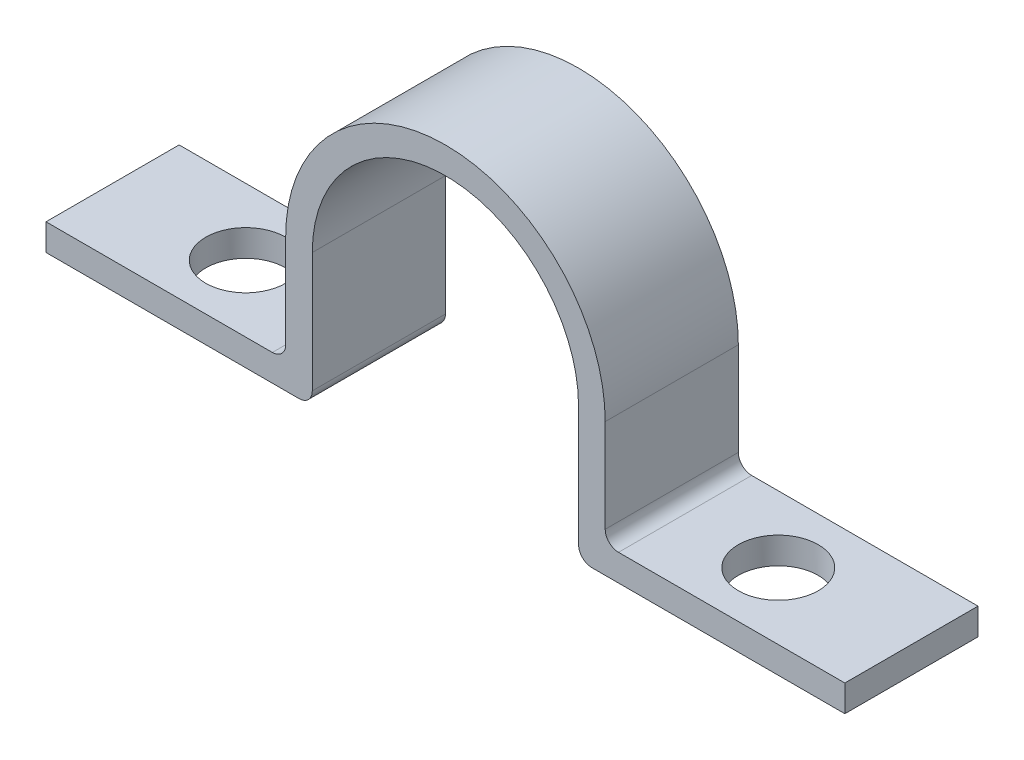
ISO-10303-21;
HEADER;
FILE_DESCRIPTION(('STEP AP214'),'2;1');
FILE_NAME('part.step','',(''),(''),'','','');
FILE_SCHEMA(('AUTOMOTIVE_DESIGN { 1 0 10303 214 1 1 1 1 }'));
ENDSEC;
DATA;
#1=APPLICATION_CONTEXT('core data for automotive mechanical design processes');
#2=APPLICATION_PROTOCOL_DEFINITION('international standard','automotive_design',2000,#1);
#3=PRODUCT_CONTEXT('',#1,'mechanical');
#4=PRODUCT('Part','Part','',(#3));
#5=PRODUCT_RELATED_PRODUCT_CATEGORY('part','',(#4));
#6=PRODUCT_DEFINITION_FORMATION('','',#4);
#7=PRODUCT_DEFINITION_CONTEXT('part definition',#1,'design');
#8=PRODUCT_DEFINITION('design','',#6,#7);
#9=PRODUCT_DEFINITION_SHAPE('','',#8);
#10=(LENGTH_UNIT() NAMED_UNIT(*) SI_UNIT(.MILLI.,.METRE.));
#11=(NAMED_UNIT(*) PLANE_ANGLE_UNIT() SI_UNIT($,.RADIAN.));
#12=(NAMED_UNIT(*) SI_UNIT($,.STERADIAN.) SOLID_ANGLE_UNIT());
#13=UNCERTAINTY_MEASURE_WITH_UNIT(LENGTH_MEASURE(1.E-05),#10,'distance_accuracy_value','');
#14=(GEOMETRIC_REPRESENTATION_CONTEXT(3) GLOBAL_UNCERTAINTY_ASSIGNED_CONTEXT((#13)) GLOBAL_UNIT_ASSIGNED_CONTEXT((#10,
#11,#12)) REPRESENTATION_CONTEXT('',''));
#15=CARTESIAN_POINT('',(0.,0.,0.));
#16=DIRECTION('',(0.,0.,1.));
#17=DIRECTION('',(1.,0.,0.));
#18=AXIS2_PLACEMENT_3D('',#15,#16,#17);
#19=CARTESIAN_POINT('',(0.,5.,5.));
#20=DIRECTION('',(0.,0.,-1.));
#21=DIRECTION('',(-1.,0.,0.));
#22=AXIS2_PLACEMENT_3D('',#19,#20,#21);
#23=CYLINDRICAL_SURFACE('',#22,5.);
#24=CARTESIAN_POINT('',(0.,5.,0.));
#25=DIRECTION('',(0.,0.,-1.));
#26=DIRECTION('',(1.,0.,0.));
#27=AXIS2_PLACEMENT_3D('',#24,#25,#26);
#28=CIRCLE('',#27,5.);
#29=CARTESIAN_POINT('',(-5.,5.,0.));
#30=VERTEX_POINT('',#29);
#31=CARTESIAN_POINT('',(5.,5.,0.));
#32=VERTEX_POINT('',#31);
#33=EDGE_CURVE('E185',#30,#32,#28,.T.);
#34=ORIENTED_EDGE('',*,*,#33,.T.);
#35=DIRECTION('',(0.,0.,-1.));
#36=VECTOR('',#35,1.);
#37=CARTESIAN_POINT('',(5.,5.,5.));
#38=LINE('',#37,#36);
#39=CARTESIAN_POINT('',(5.,5.,5.));
#40=VERTEX_POINT('',#39);
#41=EDGE_CURVE('E11',#40,#32,#38,.T.);
#42=ORIENTED_EDGE('',*,*,#41,.F.);
#43=CARTESIAN_POINT('',(0.,5.,5.));
#44=DIRECTION('',(0.,0.,-1.));
#45=DIRECTION('',(1.,0.,0.));
#46=AXIS2_PLACEMENT_3D('',#43,#44,#45);
#47=CIRCLE('',#46,5.);
#48=CARTESIAN_POINT('',(-5.,5.,5.));
#49=VERTEX_POINT('',#48);
#50=EDGE_CURVE('E215',#49,#40,#47,.T.);
#51=ORIENTED_EDGE('',*,*,#50,.F.);
#52=DIRECTION('',(0.,0.,-1.));
#53=VECTOR('',#52,1.);
#54=CARTESIAN_POINT('',(-5.,5.,5.));
#55=LINE('',#54,#53);
#56=EDGE_CURVE('E181',#49,#30,#55,.T.);
#57=ORIENTED_EDGE('',*,*,#56,.T.);
#58=EDGE_LOOP('',(#34,#42,#51,#57));
#59=FACE_BOUND('',#58,.T.);
#60=ADVANCED_FACE('F40',(#59),#23,.F.);
#61=CARTESIAN_POINT('',(5.,5.,5.));
#62=DIRECTION('',(1.,-4.47751403854925E-13,0.));
#63=DIRECTION('',(4.47751403854925E-13,1.,0.));
#64=AXIS2_PLACEMENT_3D('',#61,#62,#63);
#65=PLANE('',#64);
#66=DIRECTION('',(-4.47751403854925E-13,-1.,0.));
#67=VECTOR('',#66,1.);
#68=CARTESIAN_POINT('',(5.,5.,0.));
#69=LINE('',#68,#67);
#70=CARTESIAN_POINT('',(4.99999999999799,0.500000000000227,0.));
#71=VERTEX_POINT('',#70);
#72=EDGE_CURVE('E188',#32,#71,#69,.T.);
#73=ORIENTED_EDGE('',*,*,#72,.T.);
#74=DIRECTION('',(0.,0.,-1.));
#75=VECTOR('',#74,1.);
#76=CARTESIAN_POINT('',(4.99999999999799,0.500000000000227,5.));
#77=LINE('',#76,#75);
#78=CARTESIAN_POINT('',(4.99999999999799,0.500000000000227,5.));
#79=VERTEX_POINT('',#78);
#80=EDGE_CURVE('E49',#79,#71,#77,.T.);
#81=ORIENTED_EDGE('',*,*,#80,.F.);
#82=DIRECTION('',(-4.47751403854925E-13,-1.,0.));
#83=VECTOR('',#82,1.);
#84=CARTESIAN_POINT('',(5.,5.,5.));
#85=LINE('',#84,#83);
#86=EDGE_CURVE('E124',#40,#79,#85,.T.);
#87=ORIENTED_EDGE('',*,*,#86,.F.);
#88=ORIENTED_EDGE('',*,*,#41,.T.);
#89=EDGE_LOOP('',(#73,#81,#87,#88));
#90=FACE_BOUND('',#89,.T.);
#91=ADVANCED_FACE('F314',(#90),#65,.F.);
#92=CARTESIAN_POINT('',(5.49999999999799,0.5,5.));
#93=DIRECTION('',(0.,0.,-1.));
#94=DIRECTION('',(-1.,0.,0.));
#95=AXIS2_PLACEMENT_3D('',#92,#93,#94);
#96=CYLINDRICAL_SURFACE('',#95,0.5);
#97=CARTESIAN_POINT('',(5.49999999999799,0.5,0.));
#98=DIRECTION('',(0.,0.,1.));
#99=DIRECTION('',(-1.,0.,0.));
#100=AXIS2_PLACEMENT_3D('',#97,#98,#99);
#101=CIRCLE('',#100,0.5);
#102=CARTESIAN_POINT('',(5.49999999999799,0.,0.));
#103=VERTEX_POINT('',#102);
#104=EDGE_CURVE('E190',#71,#103,#101,.T.);
#105=ORIENTED_EDGE('',*,*,#104,.T.);
#106=DIRECTION('',(0.,0.,-1.));
#107=VECTOR('',#106,1.);
#108=CARTESIAN_POINT('',(5.49999999999799,0.,5.));
#109=LINE('',#108,#107);
#110=CARTESIAN_POINT('',(5.49999999999799,0.,5.));
#111=VERTEX_POINT('',#110);
#112=EDGE_CURVE('E246',#111,#103,#109,.T.);
#113=ORIENTED_EDGE('',*,*,#112,.F.);
#114=CARTESIAN_POINT('',(5.49999999999799,0.5,5.));
#115=DIRECTION('',(0.,0.,1.));
#116=DIRECTION('',(-1.,0.,0.));
#117=AXIS2_PLACEMENT_3D('',#114,#115,#116);
#118=CIRCLE('',#117,0.5);
#119=EDGE_CURVE('E255',#79,#111,#118,.T.);
#120=ORIENTED_EDGE('',*,*,#119,.F.);
#121=ORIENTED_EDGE('',*,*,#80,.T.);
#122=EDGE_LOOP('',(#105,#113,#120,#121));
#123=FACE_BOUND('',#122,.T.);
#124=ADVANCED_FACE('F253',(#123),#96,.T.);
#125=CARTESIAN_POINT('',(5.49999999999799,0.,5.));
#126=DIRECTION('',(0.,1.,0.));
#127=DIRECTION('',(0.,0.,1.));
#128=AXIS2_PLACEMENT_3D('',#125,#126,#127);
#129=PLANE('',#128);
#130=CARTESIAN_POINT('',(10.,0.,2.5));
#131=DIRECTION('',(0.,1.,0.));
#132=DIRECTION('',(0.,0.,1.));
#133=AXIS2_PLACEMENT_3D('',#130,#131,#132);
#134=CIRCLE('',#133,1.5);
#135=CARTESIAN_POINT('',(10.,0.,4.));
#136=VERTEX_POINT('',#135);
#137=EDGE_CURVE('E366',#136,#136,#134,.T.);
#138=ORIENTED_EDGE('',*,*,#137,.T.);
#139=EDGE_LOOP('',(#138));
#140=FACE_BOUND('',#139,.T.);
#141=DIRECTION('',(1.,0.,0.));
#142=VECTOR('',#141,1.);
#143=CARTESIAN_POINT('',(5.49999999999799,0.,0.));
#144=LINE('',#143,#142);
#145=CARTESIAN_POINT('',(15.,0.,0.));
#146=VERTEX_POINT('',#145);
#147=EDGE_CURVE('E192',#103,#146,#144,.T.);
#148=ORIENTED_EDGE('',*,*,#147,.T.);
#149=DIRECTION('',(0.,0.,-1.));
#150=VECTOR('',#149,1.);
#151=CARTESIAN_POINT('',(15.,0.,5.));
#152=LINE('',#151,#150);
#153=CARTESIAN_POINT('',(15.,0.,5.));
#154=VERTEX_POINT('',#153);
#155=EDGE_CURVE('E243',#154,#146,#152,.T.);
#156=ORIENTED_EDGE('',*,*,#155,.F.);
#157=DIRECTION('',(1.,0.,0.));
#158=VECTOR('',#157,1.);
#159=CARTESIAN_POINT('',(5.49999999999799,0.,5.));
#160=LINE('',#159,#158);
#161=EDGE_CURVE('E273',#111,#154,#160,.T.);
#162=ORIENTED_EDGE('',*,*,#161,.F.);
#163=ORIENTED_EDGE('',*,*,#112,.T.);
#164=EDGE_LOOP('',(#148,#156,#162,#163));
#165=FACE_BOUND('',#164,.T.);
#166=ADVANCED_FACE('F264',(#140,#165),#129,.F.);
#167=CARTESIAN_POINT('',(15.,1.,5.));
#168=DIRECTION('',(-1.,0.,0.));
#169=DIRECTION('',(0.,0.,1.));
#170=AXIS2_PLACEMENT_3D('',#167,#168,#169);
#171=PLANE('',#170);
#172=DIRECTION('',(0.,1.,0.));
#173=VECTOR('',#172,1.);
#174=CARTESIAN_POINT('',(15.,1.,0.));
#175=LINE('',#174,#173);
#176=CARTESIAN_POINT('',(15.,1.,0.));
#177=VERTEX_POINT('',#176);
#178=EDGE_CURVE('E194',#146,#177,#175,.T.);
#179=ORIENTED_EDGE('',*,*,#178,.T.);
#180=DIRECTION('',(0.,0.,-1.));
#181=VECTOR('',#180,1.);
#182=CARTESIAN_POINT('',(15.,1.,5.));
#183=LINE('',#182,#181);
#184=CARTESIAN_POINT('',(15.,1.,5.));
#185=VERTEX_POINT('',#184);
#186=EDGE_CURVE('E240',#185,#177,#183,.T.);
#187=ORIENTED_EDGE('',*,*,#186,.F.);
#188=DIRECTION('',(0.,1.,0.));
#189=VECTOR('',#188,1.);
#190=CARTESIAN_POINT('',(15.,1.,5.));
#191=LINE('',#190,#189);
#192=EDGE_CURVE('E270',#154,#185,#191,.T.);
#193=ORIENTED_EDGE('',*,*,#192,.F.);
#194=ORIENTED_EDGE('',*,*,#155,.T.);
#195=EDGE_LOOP('',(#179,#187,#193,#194));
#196=FACE_BOUND('',#195,.T.);
#197=ADVANCED_FACE('F268',(#196),#171,.F.);
#198=CARTESIAN_POINT('',(6.5,1.,5.));
#199=DIRECTION('',(0.,-1.,0.));
#200=DIRECTION('',(0.,0.,-1.));
#201=AXIS2_PLACEMENT_3D('',#198,#199,#200);
#202=PLANE('',#201);
#203=CARTESIAN_POINT('',(10.,1.,2.5));
#204=DIRECTION('',(0.,-1.,0.));
#205=DIRECTION('',(0.,0.,-1.));
#206=AXIS2_PLACEMENT_3D('',#203,#204,#205);
#207=CIRCLE('',#206,1.5);
#208=CARTESIAN_POINT('',(10.,1.,0.999999999999999));
#209=VERTEX_POINT('',#208);
#210=EDGE_CURVE('E43',#209,#209,#207,.T.);
#211=ORIENTED_EDGE('',*,*,#210,.T.);
#212=EDGE_LOOP('',(#211));
#213=FACE_BOUND('',#212,.T.);
#214=DIRECTION('',(-1.,0.,0.));
#215=VECTOR('',#214,1.);
#216=CARTESIAN_POINT('',(6.5,1.,0.));
#217=LINE('',#216,#215);
#218=CARTESIAN_POINT('',(6.5,1.,0.));
#219=VERTEX_POINT('',#218);
#220=EDGE_CURVE('E196',#177,#219,#217,.T.);
#221=ORIENTED_EDGE('',*,*,#220,.T.);
#222=DIRECTION('',(0.,0.,-1.));
#223=VECTOR('',#222,1.);
#224=CARTESIAN_POINT('',(6.5,1.,5.));
#225=LINE('',#224,#223);
#226=CARTESIAN_POINT('',(6.5,1.,5.));
#227=VERTEX_POINT('',#226);
#228=EDGE_CURVE('E237',#227,#219,#225,.T.);
#229=ORIENTED_EDGE('',*,*,#228,.F.);
#230=DIRECTION('',(-1.,0.,0.));
#231=VECTOR('',#230,1.);
#232=CARTESIAN_POINT('',(6.5,1.,5.));
#233=LINE('',#232,#231);
#234=EDGE_CURVE('E272',#185,#227,#233,.T.);
#235=ORIENTED_EDGE('',*,*,#234,.F.);
#236=ORIENTED_EDGE('',*,*,#186,.T.);
#237=EDGE_LOOP('',(#221,#229,#235,#236));
#238=FACE_BOUND('',#237,.T.);
#239=ADVANCED_FACE('F328',(#213,#238),#202,.F.);
#240=CARTESIAN_POINT('',(6.5,1.5,5.));
#241=DIRECTION('',(0.,0.,-1.));
#242=DIRECTION('',(-1.,0.,0.));
#243=AXIS2_PLACEMENT_3D('',#240,#241,#242);
#244=CYLINDRICAL_SURFACE('',#243,0.5);
#245=CARTESIAN_POINT('',(6.5,1.5,0.));
#246=DIRECTION('',(0.,0.,-1.));
#247=DIRECTION('',(-1.,0.,0.));
#248=AXIS2_PLACEMENT_3D('',#245,#246,#247);
#249=CIRCLE('',#248,0.5);
#250=CARTESIAN_POINT('',(6.,1.5,0.));
#251=VERTEX_POINT('',#250);
#252=EDGE_CURVE('E198',#219,#251,#249,.T.);
#253=ORIENTED_EDGE('',*,*,#252,.T.);
#254=DIRECTION('',(0.,0.,-1.));
#255=VECTOR('',#254,1.);
#256=CARTESIAN_POINT('',(6.,1.5,5.));
#257=LINE('',#256,#255);
#258=CARTESIAN_POINT('',(6.,1.5,5.));
#259=VERTEX_POINT('',#258);
#260=EDGE_CURVE('E234',#259,#251,#257,.T.);
#261=ORIENTED_EDGE('',*,*,#260,.F.);
#262=CARTESIAN_POINT('',(6.5,1.5,5.));
#263=DIRECTION('',(0.,0.,-1.));
#264=DIRECTION('',(-1.,0.,0.));
#265=AXIS2_PLACEMENT_3D('',#262,#263,#264);
#266=CIRCLE('',#265,0.5);
#267=EDGE_CURVE('E275',#227,#259,#266,.T.);
#268=ORIENTED_EDGE('',*,*,#267,.F.);
#269=ORIENTED_EDGE('',*,*,#228,.T.);
#270=EDGE_LOOP('',(#253,#261,#268,#269));
#271=FACE_BOUND('',#270,.T.);
#272=ADVANCED_FACE('F331',(#271),#244,.F.);
#273=CARTESIAN_POINT('',(6.,5.,5.));
#274=DIRECTION('',(-1.,0.,0.));
#275=DIRECTION('',(0.,0.,1.));
#276=AXIS2_PLACEMENT_3D('',#273,#274,#275);
#277=PLANE('',#276);
#278=DIRECTION('',(0.,1.,0.));
#279=VECTOR('',#278,1.);
#280=CARTESIAN_POINT('',(6.,5.,0.));
#281=LINE('',#280,#279);
#282=CARTESIAN_POINT('',(6.,5.,0.));
#283=VERTEX_POINT('',#282);
#284=EDGE_CURVE('E200',#251,#283,#281,.T.);
#285=ORIENTED_EDGE('',*,*,#284,.T.);
#286=DIRECTION('',(0.,0.,-1.));
#287=VECTOR('',#286,1.);
#288=CARTESIAN_POINT('',(6.,5.,5.));
#289=LINE('',#288,#287);
#290=CARTESIAN_POINT('',(6.,5.,5.));
#291=VERTEX_POINT('',#290);
#292=EDGE_CURVE('E231',#291,#283,#289,.T.);
#293=ORIENTED_EDGE('',*,*,#292,.F.);
#294=DIRECTION('',(0.,1.,0.));
#295=VECTOR('',#294,1.);
#296=CARTESIAN_POINT('',(6.,5.,5.));
#297=LINE('',#296,#295);
#298=EDGE_CURVE('E281',#259,#291,#297,.T.);
#299=ORIENTED_EDGE('',*,*,#298,.F.);
#300=ORIENTED_EDGE('',*,*,#260,.T.);
#301=EDGE_LOOP('',(#285,#293,#299,#300));
#302=FACE_BOUND('',#301,.T.);
#303=ADVANCED_FACE('F335',(#302),#277,.F.);
#304=CARTESIAN_POINT('',(0.,5.,5.));
#305=DIRECTION('',(0.,0.,-1.));
#306=DIRECTION('',(-1.,0.,0.));
#307=AXIS2_PLACEMENT_3D('',#304,#305,#306);
#308=CYLINDRICAL_SURFACE('',#307,6.);
#309=CARTESIAN_POINT('',(0.,5.,0.));
#310=DIRECTION('',(0.,0.,1.));
#311=DIRECTION('',(1.,0.,0.));
#312=AXIS2_PLACEMENT_3D('',#309,#310,#311);
#313=CIRCLE('',#312,6.);
#314=CARTESIAN_POINT('',(-6.,5.,0.));
#315=VERTEX_POINT('',#314);
#316=EDGE_CURVE('E202',#283,#315,#313,.T.);
#317=ORIENTED_EDGE('',*,*,#316,.T.);
#318=DIRECTION('',(0.,0.,-1.));
#319=VECTOR('',#318,1.);
#320=CARTESIAN_POINT('',(-6.,5.,5.));
#321=LINE('',#320,#319);
#322=CARTESIAN_POINT('',(-6.,5.,5.));
#323=VERTEX_POINT('',#322);
#324=EDGE_CURVE('E228',#323,#315,#321,.T.);
#325=ORIENTED_EDGE('',*,*,#324,.F.);
#326=CARTESIAN_POINT('',(0.,5.,5.));
#327=DIRECTION('',(0.,0.,1.));
#328=DIRECTION('',(1.,0.,0.));
#329=AXIS2_PLACEMENT_3D('',#326,#327,#328);
#330=CIRCLE('',#329,6.);
#331=EDGE_CURVE('E283',#291,#323,#330,.T.);
#332=ORIENTED_EDGE('',*,*,#331,.F.);
#333=ORIENTED_EDGE('',*,*,#292,.T.);
#334=EDGE_LOOP('',(#317,#325,#332,#333));
#335=FACE_BOUND('',#334,.T.);
#336=ADVANCED_FACE('F339',(#335),#308,.T.);
#337=CARTESIAN_POINT('',(-6.,5.,5.));
#338=DIRECTION('',(1.,0.,0.));
#339=DIRECTION('',(0.,0.,-1.));
#340=AXIS2_PLACEMENT_3D('',#337,#338,#339);
#341=PLANE('',#340);
#342=DIRECTION('',(0.,-1.,0.));
#343=VECTOR('',#342,1.);
#344=CARTESIAN_POINT('',(-6.,5.,0.));
#345=LINE('',#344,#343);
#346=CARTESIAN_POINT('',(-6.,1.5,0.));
#347=VERTEX_POINT('',#346);
#348=EDGE_CURVE('E204',#315,#347,#345,.T.);
#349=ORIENTED_EDGE('',*,*,#348,.T.);
#350=DIRECTION('',(0.,0.,-1.));
#351=VECTOR('',#350,1.);
#352=CARTESIAN_POINT('',(-6.,1.5,5.));
#353=LINE('',#352,#351);
#354=CARTESIAN_POINT('',(-6.,1.5,5.));
#355=VERTEX_POINT('',#354);
#356=EDGE_CURVE('E225',#355,#347,#353,.T.);
#357=ORIENTED_EDGE('',*,*,#356,.F.);
#358=DIRECTION('',(0.,-1.,0.));
#359=VECTOR('',#358,1.);
#360=CARTESIAN_POINT('',(-6.,5.,5.));
#361=LINE('',#360,#359);
#362=EDGE_CURVE('E285',#323,#355,#361,.T.);
#363=ORIENTED_EDGE('',*,*,#362,.F.);
#364=ORIENTED_EDGE('',*,*,#324,.T.);
#365=EDGE_LOOP('',(#349,#357,#363,#364));
#366=FACE_BOUND('',#365,.T.);
#367=ADVANCED_FACE('F343',(#366),#341,.F.);
#368=CARTESIAN_POINT('',(-6.5,1.5,5.));
#369=DIRECTION('',(0.,0.,-1.));
#370=DIRECTION('',(-1.,0.,0.));
#371=AXIS2_PLACEMENT_3D('',#368,#369,#370);
#372=CYLINDRICAL_SURFACE('',#371,0.5);
#373=CARTESIAN_POINT('',(-6.5,1.5,0.));
#374=DIRECTION('',(0.,0.,-1.));
#375=DIRECTION('',(1.,0.,0.));
#376=AXIS2_PLACEMENT_3D('',#373,#374,#375);
#377=CIRCLE('',#376,0.5);
#378=CARTESIAN_POINT('',(-6.5,1.,0.));
#379=VERTEX_POINT('',#378);
#380=EDGE_CURVE('E206',#347,#379,#377,.T.);
#381=ORIENTED_EDGE('',*,*,#380,.T.);
#382=DIRECTION('',(0.,0.,-1.));
#383=VECTOR('',#382,1.);
#384=CARTESIAN_POINT('',(-6.5,1.,5.));
#385=LINE('',#384,#383);
#386=CARTESIAN_POINT('',(-6.5,1.,5.));
#387=VERTEX_POINT('',#386);
#388=EDGE_CURVE('E222',#387,#379,#385,.T.);
#389=ORIENTED_EDGE('',*,*,#388,.F.);
#390=CARTESIAN_POINT('',(-6.5,1.5,5.));
#391=DIRECTION('',(0.,0.,-1.));
#392=DIRECTION('',(1.,0.,0.));
#393=AXIS2_PLACEMENT_3D('',#390,#391,#392);
#394=CIRCLE('',#393,0.5);
#395=EDGE_CURVE('E287',#355,#387,#394,.T.);
#396=ORIENTED_EDGE('',*,*,#395,.F.);
#397=ORIENTED_EDGE('',*,*,#356,.T.);
#398=EDGE_LOOP('',(#381,#389,#396,#397));
#399=FACE_BOUND('',#398,.T.);
#400=ADVANCED_FACE('F347',(#399),#372,.F.);
#401=CARTESIAN_POINT('',(-6.5,1.,5.));
#402=DIRECTION('',(0.,-1.,0.));
#403=DIRECTION('',(0.,0.,-1.));
#404=AXIS2_PLACEMENT_3D('',#401,#402,#403);
#405=PLANE('',#404);
#406=CARTESIAN_POINT('',(-10.,1.,2.5));
#407=DIRECTION('',(0.,-1.,0.));
#408=DIRECTION('',(0.,0.,-1.));
#409=AXIS2_PLACEMENT_3D('',#406,#407,#408);
#410=CIRCLE('',#409,1.5);
#411=CARTESIAN_POINT('',(-10.,1.,0.999999999999999));
#412=VERTEX_POINT('',#411);
#413=EDGE_CURVE('E365',#412,#412,#410,.T.);
#414=ORIENTED_EDGE('',*,*,#413,.T.);
#415=EDGE_LOOP('',(#414));
#416=FACE_BOUND('',#415,.T.);
#417=DIRECTION('',(-1.,0.,0.));
#418=VECTOR('',#417,1.);
#419=CARTESIAN_POINT('',(-6.5,1.,0.));
#420=LINE('',#419,#418);
#421=CARTESIAN_POINT('',(-15.,1.,0.));
#422=VERTEX_POINT('',#421);
#423=EDGE_CURVE('E208',#379,#422,#420,.T.);
#424=ORIENTED_EDGE('',*,*,#423,.T.);
#425=DIRECTION('',(0.,0.,-1.));
#426=VECTOR('',#425,1.);
#427=CARTESIAN_POINT('',(-15.,1.,5.));
#428=LINE('',#427,#426);
#429=CARTESIAN_POINT('',(-15.,1.,5.));
#430=VERTEX_POINT('',#429);
#431=EDGE_CURVE('E219',#430,#422,#428,.T.);
#432=ORIENTED_EDGE('',*,*,#431,.F.);
#433=DIRECTION('',(-1.,0.,0.));
#434=VECTOR('',#433,1.);
#435=CARTESIAN_POINT('',(-6.5,1.,5.));
#436=LINE('',#435,#434);
#437=EDGE_CURVE('E289',#387,#430,#436,.T.);
#438=ORIENTED_EDGE('',*,*,#437,.F.);
#439=ORIENTED_EDGE('',*,*,#388,.T.);
#440=EDGE_LOOP('',(#424,#432,#438,#439));
#441=FACE_BOUND('',#440,.T.);
#442=ADVANCED_FACE('F295',(#416,#441),#405,.F.);
#443=CARTESIAN_POINT('',(-15.,1.,5.));
#444=DIRECTION('',(1.,0.,0.));
#445=DIRECTION('',(0.,0.,-1.));
#446=AXIS2_PLACEMENT_3D('',#443,#444,#445);
#447=PLANE('',#446);
#448=DIRECTION('',(0.,-1.,0.));
#449=VECTOR('',#448,1.);
#450=CARTESIAN_POINT('',(-15.,1.,0.));
#451=LINE('',#450,#449);
#452=CARTESIAN_POINT('',(-15.,0.,0.));
#453=VERTEX_POINT('',#452);
#454=EDGE_CURVE('E210',#422,#453,#451,.T.);
#455=ORIENTED_EDGE('',*,*,#454,.T.);
#456=DIRECTION('',(0.,0.,-1.));
#457=VECTOR('',#456,1.);
#458=CARTESIAN_POINT('',(-15.,0.,5.));
#459=LINE('',#458,#457);
#460=CARTESIAN_POINT('',(-15.,0.,5.));
#461=VERTEX_POINT('',#460);
#462=EDGE_CURVE('E176',#461,#453,#459,.T.);
#463=ORIENTED_EDGE('',*,*,#462,.F.);
#464=DIRECTION('',(0.,-1.,0.));
#465=VECTOR('',#464,1.);
#466=CARTESIAN_POINT('',(-15.,1.,5.));
#467=LINE('',#466,#465);
#468=EDGE_CURVE('E167',#430,#461,#467,.T.);
#469=ORIENTED_EDGE('',*,*,#468,.F.);
#470=ORIENTED_EDGE('',*,*,#431,.T.);
#471=EDGE_LOOP('',(#455,#463,#469,#470));
#472=FACE_BOUND('',#471,.T.);
#473=ADVANCED_FACE('F299',(#472),#447,.F.);
#474=CARTESIAN_POINT('',(-5.49999999999796,0.,5.));
#475=DIRECTION('',(0.,1.,0.));
#476=DIRECTION('',(0.,0.,1.));
#477=AXIS2_PLACEMENT_3D('',#474,#475,#476);
#478=PLANE('',#477);
#479=CARTESIAN_POINT('',(-10.,0.,2.5));
#480=DIRECTION('',(0.,1.,0.));
#481=DIRECTION('',(0.,0.,1.));
#482=AXIS2_PLACEMENT_3D('',#479,#480,#481);
#483=CIRCLE('',#482,1.5);
#484=CARTESIAN_POINT('',(-10.,0.,4.));
#485=VERTEX_POINT('',#484);
#486=EDGE_CURVE('E363',#485,#485,#483,.T.);
#487=ORIENTED_EDGE('',*,*,#486,.T.);
#488=EDGE_LOOP('',(#487));
#489=FACE_BOUND('',#488,.T.);
#490=DIRECTION('',(1.,0.,0.));
#491=VECTOR('',#490,1.);
#492=CARTESIAN_POINT('',(-5.49999999999796,0.,0.));
#493=LINE('',#492,#491);
#494=CARTESIAN_POINT('',(-5.49999999999796,0.,0.));
#495=VERTEX_POINT('',#494);
#496=EDGE_CURVE('E175',#453,#495,#493,.T.);
#497=ORIENTED_EDGE('',*,*,#496,.T.);
#498=DIRECTION('',(0.,0.,-1.));
#499=VECTOR('',#498,1.);
#500=CARTESIAN_POINT('',(-5.49999999999796,0.,5.));
#501=LINE('',#500,#499);
#502=CARTESIAN_POINT('',(-5.49999999999796,0.,5.));
#503=VERTEX_POINT('',#502);
#504=EDGE_CURVE('E172',#503,#495,#501,.T.);
#505=ORIENTED_EDGE('',*,*,#504,.F.);
#506=DIRECTION('',(1.,0.,0.));
#507=VECTOR('',#506,1.);
#508=CARTESIAN_POINT('',(-5.49999999999796,0.,5.));
#509=LINE('',#508,#507);
#510=EDGE_CURVE('E161',#461,#503,#509,.T.);
#511=ORIENTED_EDGE('',*,*,#510,.F.);
#512=ORIENTED_EDGE('',*,*,#462,.T.);
#513=EDGE_LOOP('',(#497,#505,#511,#512));
#514=FACE_BOUND('',#513,.T.);
#515=ADVANCED_FACE('F173',(#489,#514),#478,.F.);
#516=CARTESIAN_POINT('',(-5.49999999999795,0.5,5.));
#517=DIRECTION('',(0.,0.,-1.));
#518=DIRECTION('',(-1.,0.,0.));
#519=AXIS2_PLACEMENT_3D('',#516,#517,#518);
#520=CYLINDRICAL_SURFACE('',#519,0.5);
#521=CARTESIAN_POINT('',(-5.49999999999795,0.5,0.));
#522=DIRECTION('',(0.,0.,1.));
#523=DIRECTION('',(-1.,0.,0.));
#524=AXIS2_PLACEMENT_3D('',#521,#522,#523);
#525=CIRCLE('',#524,0.5);
#526=CARTESIAN_POINT('',(-4.99999999999795,0.500000000000231,0.));
#527=VERTEX_POINT('',#526);
#528=EDGE_CURVE('E110',#495,#527,#525,.T.);
#529=ORIENTED_EDGE('',*,*,#528,.T.);
#530=DIRECTION('',(0.,0.,-1.));
#531=VECTOR('',#530,1.);
#532=CARTESIAN_POINT('',(-4.99999999999795,0.500000000000231,5.));
#533=LINE('',#532,#531);
#534=CARTESIAN_POINT('',(-4.99999999999795,0.500000000000231,5.));
#535=VERTEX_POINT('',#534);
#536=EDGE_CURVE('E177',#535,#527,#533,.T.);
#537=ORIENTED_EDGE('',*,*,#536,.F.);
#538=CARTESIAN_POINT('',(-5.49999999999795,0.5,5.));
#539=DIRECTION('',(0.,0.,1.));
#540=DIRECTION('',(-1.,0.,0.));
#541=AXIS2_PLACEMENT_3D('',#538,#539,#540);
#542=CIRCLE('',#541,0.5);
#543=EDGE_CURVE('E165',#503,#535,#542,.T.);
#544=ORIENTED_EDGE('',*,*,#543,.F.);
#545=ORIENTED_EDGE('',*,*,#504,.T.);
#546=EDGE_LOOP('',(#529,#537,#544,#545));
#547=FACE_BOUND('',#546,.T.);
#548=ADVANCED_FACE('F179',(#547),#520,.T.);
#549=CARTESIAN_POINT('',(-5.,5.,5.));
#550=DIRECTION('',(-1.,-4.54690297758833E-13,0.));
#551=DIRECTION('',(4.54690297758833E-13,-1.,0.));
#552=AXIS2_PLACEMENT_3D('',#549,#550,#551);
#553=PLANE('',#552);
#554=DIRECTION('',(-4.54690297758833E-13,1.,0.));
#555=VECTOR('',#554,1.);
#556=CARTESIAN_POINT('',(-5.,5.,0.));
#557=LINE('',#556,#555);
#558=EDGE_CURVE('E116',#527,#30,#557,.T.);
#559=ORIENTED_EDGE('',*,*,#558,.T.);
#560=ORIENTED_EDGE('',*,*,#56,.F.);
#561=DIRECTION('',(-4.54690297758833E-13,1.,0.));
#562=VECTOR('',#561,1.);
#563=CARTESIAN_POINT('',(-5.,5.,5.));
#564=LINE('',#563,#562);
#565=EDGE_CURVE('E57',#535,#49,#564,.T.);
#566=ORIENTED_EDGE('',*,*,#565,.F.);
#567=ORIENTED_EDGE('',*,*,#536,.T.);
#568=EDGE_LOOP('',(#559,#560,#566,#567));
#569=FACE_BOUND('',#568,.T.);
#570=ADVANCED_FACE('F303',(#569),#553,.F.);
#571=CARTESIAN_POINT('',(0.,5.,5.));
#572=DIRECTION('',(0.,0.,1.));
#573=DIRECTION('',(1.,0.,0.));
#574=AXIS2_PLACEMENT_3D('',#571,#572,#573);
#575=PLANE('',#574);
#576=ORIENTED_EDGE('',*,*,#50,.T.);
#577=ORIENTED_EDGE('',*,*,#86,.T.);
#578=ORIENTED_EDGE('',*,*,#119,.T.);
#579=ORIENTED_EDGE('',*,*,#161,.T.);
#580=ORIENTED_EDGE('',*,*,#192,.T.);
#581=ORIENTED_EDGE('',*,*,#234,.T.);
#582=ORIENTED_EDGE('',*,*,#267,.T.);
#583=ORIENTED_EDGE('',*,*,#298,.T.);
#584=ORIENTED_EDGE('',*,*,#331,.T.);
#585=ORIENTED_EDGE('',*,*,#362,.T.);
#586=ORIENTED_EDGE('',*,*,#395,.T.);
#587=ORIENTED_EDGE('',*,*,#437,.T.);
#588=ORIENTED_EDGE('',*,*,#468,.T.);
#589=ORIENTED_EDGE('',*,*,#510,.T.);
#590=ORIENTED_EDGE('',*,*,#543,.T.);
#591=ORIENTED_EDGE('',*,*,#565,.T.);
#592=EDGE_LOOP('',(#576,#577,#578,#579,#580,#581,#582,#583,#584,#585,#586,#587,#588,#589,#590,#591));
#593=FACE_BOUND('',#592,.T.);
#594=ADVANCED_FACE('F163',(#593),#575,.T.);
#595=CARTESIAN_POINT('',(0.,5.,0.));
#596=DIRECTION('',(0.,0.,1.));
#597=DIRECTION('',(1.,0.,0.));
#598=AXIS2_PLACEMENT_3D('',#595,#596,#597);
#599=PLANE('',#598);
#600=ORIENTED_EDGE('',*,*,#33,.F.);
#601=ORIENTED_EDGE('',*,*,#558,.F.);
#602=ORIENTED_EDGE('',*,*,#528,.F.);
#603=ORIENTED_EDGE('',*,*,#496,.F.);
#604=ORIENTED_EDGE('',*,*,#454,.F.);
#605=ORIENTED_EDGE('',*,*,#423,.F.);
#606=ORIENTED_EDGE('',*,*,#380,.F.);
#607=ORIENTED_EDGE('',*,*,#348,.F.);
#608=ORIENTED_EDGE('',*,*,#316,.F.);
#609=ORIENTED_EDGE('',*,*,#284,.F.);
#610=ORIENTED_EDGE('',*,*,#252,.F.);
#611=ORIENTED_EDGE('',*,*,#220,.F.);
#612=ORIENTED_EDGE('',*,*,#178,.F.);
#613=ORIENTED_EDGE('',*,*,#147,.F.);
#614=ORIENTED_EDGE('',*,*,#104,.F.);
#615=ORIENTED_EDGE('',*,*,#72,.F.);
#616=EDGE_LOOP('',(#600,#601,#602,#603,#604,#605,#606,#607,#608,#609,#610,#611,#612,#613,#614,#615));
#617=FACE_BOUND('',#616,.T.);
#618=ADVANCED_FACE('F259',(#617),#599,.F.);
#619=CARTESIAN_POINT('',(-10.,0.,2.5));
#620=DIRECTION('',(0.,1.,0.));
#621=DIRECTION('',(0.,0.,1.));
#622=AXIS2_PLACEMENT_3D('',#619,#620,#621);
#623=CYLINDRICAL_SURFACE('',#622,1.5);
#624=ORIENTED_EDGE('',*,*,#486,.F.);
#625=EDGE_LOOP('',(#624));
#626=FACE_BOUND('',#625,.T.);
#627=ORIENTED_EDGE('',*,*,#413,.F.);
#628=EDGE_LOOP('',(#627));
#629=FACE_BOUND('',#628,.T.);
#630=ADVANCED_FACE('F379',(#626,#629),#623,.F.);
#631=CARTESIAN_POINT('',(10.,0.,2.5));
#632=DIRECTION('',(0.,1.,0.));
#633=DIRECTION('',(0.,0.,1.));
#634=AXIS2_PLACEMENT_3D('',#631,#632,#633);
#635=CYLINDRICAL_SURFACE('',#634,1.5);
#636=ORIENTED_EDGE('',*,*,#137,.F.);
#637=EDGE_LOOP('',(#636));
#638=FACE_BOUND('',#637,.T.);
#639=ORIENTED_EDGE('',*,*,#210,.F.);
#640=EDGE_LOOP('',(#639));
#641=FACE_BOUND('',#640,.T.);
#642=ADVANCED_FACE('F376',(#638,#641),#635,.F.);
#643=CLOSED_SHELL('',(#60,#91,#124,#166,#197,#239,#272,#303,#336,#367,#400,#442,#473,#515,#548,
#570,#594,#618,#630,#642));
#644=MANIFOLD_SOLID_BREP('B2',#643);
#645=ADVANCED_BREP_SHAPE_REPRESENTATION('',(#18,#644),#14);
#646=SHAPE_DEFINITION_REPRESENTATION(#9,#645);
ENDSEC;
END-ISO-10303-21;
